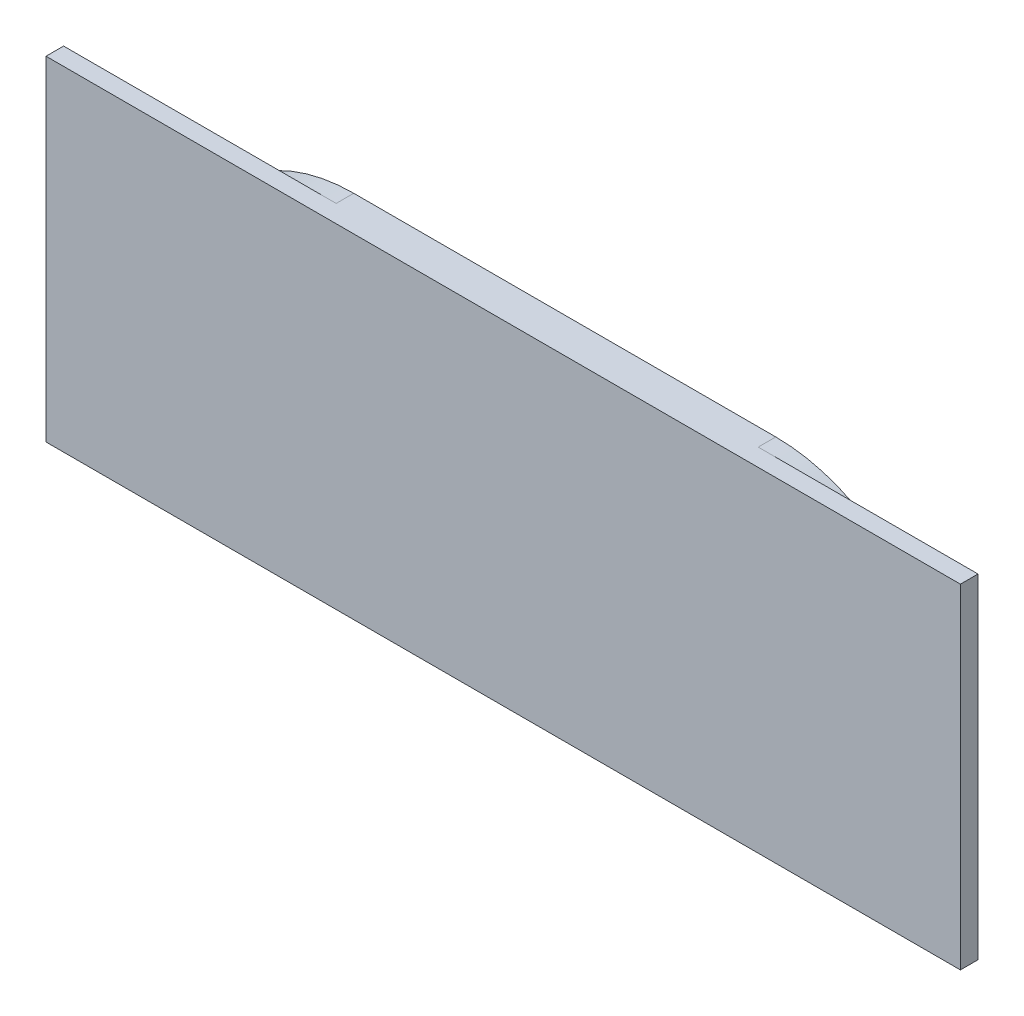
ISO-10303-21;
HEADER;
FILE_DESCRIPTION(('STEP AP214'),'2;1');
FILE_NAME('part.step','',(''),(''),'','','');
FILE_SCHEMA(('AUTOMOTIVE_DESIGN { 1 0 10303 214 1 1 1 1 }'));
ENDSEC;
DATA;
#1=APPLICATION_CONTEXT('core data for automotive mechanical design processes');
#2=APPLICATION_PROTOCOL_DEFINITION('international standard','automotive_design',2000,#1);
#3=PRODUCT_CONTEXT('',#1,'mechanical');
#4=PRODUCT('Part','Part','',(#3));
#5=PRODUCT_RELATED_PRODUCT_CATEGORY('part','',(#4));
#6=PRODUCT_DEFINITION_FORMATION('','',#4);
#7=PRODUCT_DEFINITION_CONTEXT('part definition',#1,'design');
#8=PRODUCT_DEFINITION('design','',#6,#7);
#9=PRODUCT_DEFINITION_SHAPE('','',#8);
#10=(LENGTH_UNIT() NAMED_UNIT(*) SI_UNIT(.MILLI.,.METRE.));
#11=(NAMED_UNIT(*) PLANE_ANGLE_UNIT() SI_UNIT($,.RADIAN.));
#12=(NAMED_UNIT(*) SI_UNIT($,.STERADIAN.) SOLID_ANGLE_UNIT());
#13=UNCERTAINTY_MEASURE_WITH_UNIT(LENGTH_MEASURE(1.E-05),#10,'distance_accuracy_value','');
#14=(GEOMETRIC_REPRESENTATION_CONTEXT(3) GLOBAL_UNCERTAINTY_ASSIGNED_CONTEXT((#13)) GLOBAL_UNIT_ASSIGNED_CONTEXT((#10,
#11,#12)) REPRESENTATION_CONTEXT('',''));
#15=CARTESIAN_POINT('',(0.,0.,0.));
#16=DIRECTION('',(0.,0.,1.));
#17=DIRECTION('',(1.,0.,0.));
#18=AXIS2_PLACEMENT_3D('',#15,#16,#17);
#19=CARTESIAN_POINT('',(-102.798975088645,13.4095925297114,1.));
#20=DIRECTION('',(0.,0.,-1.));
#21=DIRECTION('',(-1.,0.,0.));
#22=AXIS2_PLACEMENT_3D('',#19,#20,#21);
#23=CYLINDRICAL_SURFACE('',#22,9.5);
#24=CARTESIAN_POINT('',(-102.798975088645,13.4095925297114,0.));
#25=DIRECTION('',(0.,0.,1.));
#26=DIRECTION('',(1.,0.,0.));
#27=AXIS2_PLACEMENT_3D('',#24,#25,#26);
#28=CIRCLE('',#27,9.5);
#29=CARTESIAN_POINT('',(-102.798975088645,22.9095925297114,0.));
#30=VERTEX_POINT('',#29);
#31=CARTESIAN_POINT('',(-102.798975088645,3.90959252971138,0.));
#32=VERTEX_POINT('',#31);
#33=EDGE_CURVE('E123',#30,#32,#28,.T.);
#34=ORIENTED_EDGE('',*,*,#33,.T.);
#35=DIRECTION('',(0.,0.,-1.));
#36=VECTOR('',#35,1.);
#37=CARTESIAN_POINT('',(-102.798975088645,3.90959252971138,1.));
#38=LINE('',#37,#36);
#39=CARTESIAN_POINT('',(-102.798975088645,3.90959252971138,1.));
#40=VERTEX_POINT('',#39);
#41=EDGE_CURVE('E11',#40,#32,#38,.T.);
#42=ORIENTED_EDGE('',*,*,#41,.F.);
#43=CARTESIAN_POINT('',(-102.798975088645,13.4095925297114,1.));
#44=DIRECTION('',(0.,0.,1.));
#45=DIRECTION('',(1.,0.,0.));
#46=AXIS2_PLACEMENT_3D('',#43,#44,#45);
#47=CIRCLE('',#46,9.5);
#48=CARTESIAN_POINT('',(-102.798975088645,22.9095925297114,1.));
#49=VERTEX_POINT('',#48);
#50=EDGE_CURVE('E166',#49,#40,#47,.T.);
#51=ORIENTED_EDGE('',*,*,#50,.F.);
#52=DIRECTION('',(0.,0.,-1.));
#53=VECTOR('',#52,1.);
#54=CARTESIAN_POINT('',(-102.798975088645,22.9095925297114,1.));
#55=LINE('',#54,#53);
#56=EDGE_CURVE('E51',#49,#30,#55,.T.);
#57=ORIENTED_EDGE('',*,*,#56,.T.);
#58=EDGE_LOOP('',(#34,#42,#51,#57));
#59=FACE_BOUND('',#58,.T.);
#60=ADVANCED_FACE('F33',(#59),#23,.T.);
#61=CARTESIAN_POINT('',(-102.798975088645,3.90959252971138,1.));
#62=DIRECTION('',(0.,1.,0.));
#63=DIRECTION('',(0.,0.,1.));
#64=AXIS2_PLACEMENT_3D('',#61,#62,#63);
#65=PLANE('',#64);
#66=DIRECTION('',(1.,0.,0.));
#67=VECTOR('',#66,1.);
#68=CARTESIAN_POINT('',(-102.798975088645,3.90959252971138,0.));
#69=LINE('',#68,#67);
#70=CARTESIAN_POINT('',(-78.7989750886452,3.90959252971138,0.));
#71=VERTEX_POINT('',#70);
#72=EDGE_CURVE('E187',#32,#71,#69,.T.);
#73=ORIENTED_EDGE('',*,*,#72,.T.);
#74=DIRECTION('',(0.,0.,-1.));
#75=VECTOR('',#74,1.);
#76=CARTESIAN_POINT('',(-78.7989750886452,3.90959252971138,1.));
#77=LINE('',#76,#75);
#78=CARTESIAN_POINT('',(-78.7989750886452,3.90959252971138,1.));
#79=VERTEX_POINT('',#78);
#80=EDGE_CURVE('E42',#79,#71,#77,.T.);
#81=ORIENTED_EDGE('',*,*,#80,.F.);
#82=DIRECTION('',(1.,0.,0.));
#83=VECTOR('',#82,1.);
#84=CARTESIAN_POINT('',(-118.298975088645,3.90959252971138,1.));
#85=LINE('',#84,#83);
#86=CARTESIAN_POINT('',(-66.2989750886452,3.90959252971138,1.));
#87=VERTEX_POINT('',#86);
#88=EDGE_CURVE('E156',#79,#87,#85,.T.);
#89=ORIENTED_EDGE('',*,*,#88,.T.);
#90=DIRECTION('',(0.,0.,-1.));
#91=VECTOR('',#90,1.);
#92=CARTESIAN_POINT('',(-66.2989750886452,3.90959252971138,2.));
#93=LINE('',#92,#91);
#94=CARTESIAN_POINT('',(-66.2989750886452,3.90959252971138,2.));
#95=VERTEX_POINT('',#94);
#96=EDGE_CURVE('E147',#95,#87,#93,.T.);
#97=ORIENTED_EDGE('',*,*,#96,.F.);
#98=DIRECTION('',(1.,0.,0.));
#99=VECTOR('',#98,1.);
#100=CARTESIAN_POINT('',(-118.298975088645,3.90959252971138,2.));
#101=LINE('',#100,#99);
#102=CARTESIAN_POINT('',(-118.298975088645,3.90959252971138,2.));
#103=VERTEX_POINT('',#102);
#104=EDGE_CURVE('E129',#103,#95,#101,.T.);
#105=ORIENTED_EDGE('',*,*,#104,.F.);
#106=DIRECTION('',(0.,0.,-1.));
#107=VECTOR('',#106,1.);
#108=CARTESIAN_POINT('',(-118.298975088645,3.90959252971138,2.));
#109=LINE('',#108,#107);
#110=CARTESIAN_POINT('',(-118.298975088645,3.90959252971138,1.));
#111=VERTEX_POINT('',#110);
#112=EDGE_CURVE('E124',#103,#111,#109,.T.);
#113=ORIENTED_EDGE('',*,*,#112,.T.);
#114=EDGE_CURVE('E152',#111,#40,#85,.T.);
#115=ORIENTED_EDGE('',*,*,#114,.T.);
#116=ORIENTED_EDGE('',*,*,#41,.T.);
#117=EDGE_LOOP('',(#73,#81,#89,#97,#105,#113,#115,#116));
#118=FACE_BOUND('',#117,.T.);
#119=ADVANCED_FACE('F164',(#118),#65,.F.);
#120=CARTESIAN_POINT('',(-78.7989750886452,13.4095925297114,1.));
#121=DIRECTION('',(0.,0.,-1.));
#122=DIRECTION('',(-1.,0.,0.));
#123=AXIS2_PLACEMENT_3D('',#120,#121,#122);
#124=CYLINDRICAL_SURFACE('',#123,9.5);
#125=CARTESIAN_POINT('',(-78.7989750886452,13.4095925297114,0.));
#126=DIRECTION('',(0.,0.,1.));
#127=DIRECTION('',(-1.,0.,0.));
#128=AXIS2_PLACEMENT_3D('',#125,#126,#127);
#129=CIRCLE('',#128,9.5);
#130=CARTESIAN_POINT('',(-78.7989750886452,22.9095925297114,0.));
#131=VERTEX_POINT('',#130);
#132=EDGE_CURVE('E70',#71,#131,#129,.T.);
#133=ORIENTED_EDGE('',*,*,#132,.T.);
#134=DIRECTION('',(0.,0.,-1.));
#135=VECTOR('',#134,1.);
#136=CARTESIAN_POINT('',(-78.7989750886452,22.9095925297114,1.));
#137=LINE('',#136,#135);
#138=CARTESIAN_POINT('',(-78.7989750886452,22.9095925297114,1.));
#139=VERTEX_POINT('',#138);
#140=EDGE_CURVE('E184',#139,#131,#137,.T.);
#141=ORIENTED_EDGE('',*,*,#140,.F.);
#142=CARTESIAN_POINT('',(-78.7989750886452,13.4095925297114,1.));
#143=DIRECTION('',(0.,0.,1.));
#144=DIRECTION('',(-1.,0.,0.));
#145=AXIS2_PLACEMENT_3D('',#142,#143,#144);
#146=CIRCLE('',#145,9.5);
#147=EDGE_CURVE('E167',#79,#139,#146,.T.);
#148=ORIENTED_EDGE('',*,*,#147,.F.);
#149=ORIENTED_EDGE('',*,*,#80,.T.);
#150=EDGE_LOOP('',(#133,#141,#148,#149));
#151=FACE_BOUND('',#150,.T.);
#152=ADVANCED_FACE('F199',(#151),#124,.T.);
#153=CARTESIAN_POINT('',(-102.798975088645,22.9095925297114,1.));
#154=DIRECTION('',(0.,-1.,0.));
#155=DIRECTION('',(0.,0.,-1.));
#156=AXIS2_PLACEMENT_3D('',#153,#154,#155);
#157=PLANE('',#156);
#158=DIRECTION('',(-1.,0.,0.));
#159=VECTOR('',#158,1.);
#160=CARTESIAN_POINT('',(-102.798975088645,22.9095925297114,0.));
#161=LINE('',#160,#159);
#162=EDGE_CURVE('E73',#131,#30,#161,.T.);
#163=ORIENTED_EDGE('',*,*,#162,.T.);
#164=ORIENTED_EDGE('',*,*,#56,.F.);
#165=DIRECTION('',(-1.,0.,0.));
#166=VECTOR('',#165,1.);
#167=CARTESIAN_POINT('',(-90.7989750886452,22.9095925297114,1.));
#168=LINE('',#167,#166);
#169=CARTESIAN_POINT('',(-118.298975088645,22.9095925297114,1.));
#170=VERTEX_POINT('',#169);
#171=EDGE_CURVE('E120',#49,#170,#168,.T.);
#172=ORIENTED_EDGE('',*,*,#171,.T.);
#173=DIRECTION('',(0.,0.,-1.));
#174=VECTOR('',#173,1.);
#175=CARTESIAN_POINT('',(-118.298975088645,22.9095925297114,2.));
#176=LINE('',#175,#174);
#177=CARTESIAN_POINT('',(-118.298975088645,22.9095925297114,2.));
#178=VERTEX_POINT('',#177);
#179=EDGE_CURVE('E117',#178,#170,#176,.T.);
#180=ORIENTED_EDGE('',*,*,#179,.F.);
#181=DIRECTION('',(-1.,0.,0.));
#182=VECTOR('',#181,1.);
#183=CARTESIAN_POINT('',(-66.2989750886452,22.9095925297114,2.));
#184=LINE('',#183,#182);
#185=CARTESIAN_POINT('',(-66.2989750886452,22.9095925297114,2.));
#186=VERTEX_POINT('',#185);
#187=EDGE_CURVE('E104',#186,#178,#184,.T.);
#188=ORIENTED_EDGE('',*,*,#187,.F.);
#189=DIRECTION('',(0.,0.,-1.));
#190=VECTOR('',#189,1.);
#191=CARTESIAN_POINT('',(-66.2989750886452,22.9095925297114,2.));
#192=LINE('',#191,#190);
#193=CARTESIAN_POINT('',(-66.2989750886452,22.9095925297114,1.));
#194=VERTEX_POINT('',#193);
#195=EDGE_CURVE('E134',#186,#194,#192,.T.);
#196=ORIENTED_EDGE('',*,*,#195,.T.);
#197=EDGE_CURVE('E143',#194,#139,#168,.T.);
#198=ORIENTED_EDGE('',*,*,#197,.T.);
#199=ORIENTED_EDGE('',*,*,#140,.T.);
#200=EDGE_LOOP('',(#163,#164,#172,#180,#188,#196,#198,#199));
#201=FACE_BOUND('',#200,.T.);
#202=ADVANCED_FACE('F118',(#201),#157,.F.);
#203=CARTESIAN_POINT('',(-102.798975088645,13.4095925297114,0.));
#204=DIRECTION('',(0.,0.,1.));
#205=DIRECTION('',(1.,0.,0.));
#206=AXIS2_PLACEMENT_3D('',#203,#204,#205);
#207=PLANE('',#206);
#208=ORIENTED_EDGE('',*,*,#33,.F.);
#209=ORIENTED_EDGE('',*,*,#162,.F.);
#210=ORIENTED_EDGE('',*,*,#132,.F.);
#211=ORIENTED_EDGE('',*,*,#72,.F.);
#212=EDGE_LOOP('',(#208,#209,#210,#211));
#213=FACE_BOUND('',#212,.T.);
#214=ADVANCED_FACE('F190',(#213),#207,.F.);
#215=CARTESIAN_POINT('',(0.,0.,1.));
#216=DIRECTION('',(0.,0.,1.));
#217=DIRECTION('',(1.,0.,0.));
#218=AXIS2_PLACEMENT_3D('',#215,#216,#217);
#219=PLANE('',#218);
#220=ORIENTED_EDGE('',*,*,#171,.F.);
#221=ORIENTED_EDGE('',*,*,#50,.T.);
#222=ORIENTED_EDGE('',*,*,#114,.F.);
#223=DIRECTION('',(0.,-1.,0.));
#224=VECTOR('',#223,1.);
#225=CARTESIAN_POINT('',(-118.298975088645,22.9095925297114,1.));
#226=LINE('',#225,#224);
#227=EDGE_CURVE('E137',#170,#111,#226,.T.);
#228=ORIENTED_EDGE('',*,*,#227,.F.);
#229=EDGE_LOOP('',(#220,#221,#222,#228));
#230=FACE_BOUND('',#229,.T.);
#231=ADVANCED_FACE('F165',(#230),#219,.F.);
#232=CARTESIAN_POINT('',(-118.298975088645,22.9095925297114,2.));
#233=DIRECTION('',(1.,0.,0.));
#234=DIRECTION('',(0.,0.,-1.));
#235=AXIS2_PLACEMENT_3D('',#232,#233,#234);
#236=PLANE('',#235);
#237=ORIENTED_EDGE('',*,*,#227,.T.);
#238=ORIENTED_EDGE('',*,*,#112,.F.);
#239=DIRECTION('',(0.,-1.,0.));
#240=VECTOR('',#239,1.);
#241=CARTESIAN_POINT('',(-118.298975088645,22.9095925297114,2.));
#242=LINE('',#241,#240);
#243=EDGE_CURVE('E108',#178,#103,#242,.T.);
#244=ORIENTED_EDGE('',*,*,#243,.F.);
#245=ORIENTED_EDGE('',*,*,#179,.T.);
#246=EDGE_LOOP('',(#237,#238,#244,#245));
#247=FACE_BOUND('',#246,.T.);
#248=ADVANCED_FACE('F126',(#247),#236,.F.);
#249=CARTESIAN_POINT('',(-66.2989750886452,3.90959252971138,2.));
#250=DIRECTION('',(-1.,0.,0.));
#251=DIRECTION('',(0.,0.,1.));
#252=AXIS2_PLACEMENT_3D('',#249,#250,#251);
#253=PLANE('',#252);
#254=DIRECTION('',(0.,1.,0.));
#255=VECTOR('',#254,1.);
#256=CARTESIAN_POINT('',(-66.2989750886452,3.90959252971138,1.));
#257=LINE('',#256,#255);
#258=EDGE_CURVE('E114',#87,#194,#257,.T.);
#259=ORIENTED_EDGE('',*,*,#258,.T.);
#260=ORIENTED_EDGE('',*,*,#195,.F.);
#261=DIRECTION('',(0.,1.,0.));
#262=VECTOR('',#261,1.);
#263=CARTESIAN_POINT('',(-66.2989750886452,3.90959252971138,2.));
#264=LINE('',#263,#262);
#265=EDGE_CURVE('E111',#95,#186,#264,.T.);
#266=ORIENTED_EDGE('',*,*,#265,.F.);
#267=ORIENTED_EDGE('',*,*,#96,.T.);
#268=EDGE_LOOP('',(#259,#260,#266,#267));
#269=FACE_BOUND('',#268,.T.);
#270=ADVANCED_FACE('F232',(#269),#253,.F.);
#271=CARTESIAN_POINT('',(0.,0.,2.));
#272=DIRECTION('',(0.,0.,1.));
#273=DIRECTION('',(1.,0.,0.));
#274=AXIS2_PLACEMENT_3D('',#271,#272,#273);
#275=PLANE('',#274);
#276=ORIENTED_EDGE('',*,*,#187,.T.);
#277=ORIENTED_EDGE('',*,*,#243,.T.);
#278=ORIENTED_EDGE('',*,*,#104,.T.);
#279=ORIENTED_EDGE('',*,*,#265,.T.);
#280=EDGE_LOOP('',(#276,#277,#278,#279));
#281=FACE_BOUND('',#280,.T.);
#282=ADVANCED_FACE('F106',(#281),#275,.T.);
#283=ORIENTED_EDGE('',*,*,#88,.F.);
#284=ORIENTED_EDGE('',*,*,#147,.T.);
#285=ORIENTED_EDGE('',*,*,#197,.F.);
#286=ORIENTED_EDGE('',*,*,#258,.F.);
#287=EDGE_LOOP('',(#283,#284,#285,#286));
#288=FACE_BOUND('',#287,.T.);
#289=ADVANCED_FACE('F198',(#288),#219,.F.);
#290=CLOSED_SHELL('',(#60,#119,#152,#202,#214,#231,#248,#270,#282,#289));
#291=MANIFOLD_SOLID_BREP('B2',#290);
#292=ADVANCED_BREP_SHAPE_REPRESENTATION('',(#18,#291),#14);
#293=SHAPE_DEFINITION_REPRESENTATION(#9,#292);
ENDSEC;
END-ISO-10303-21;
